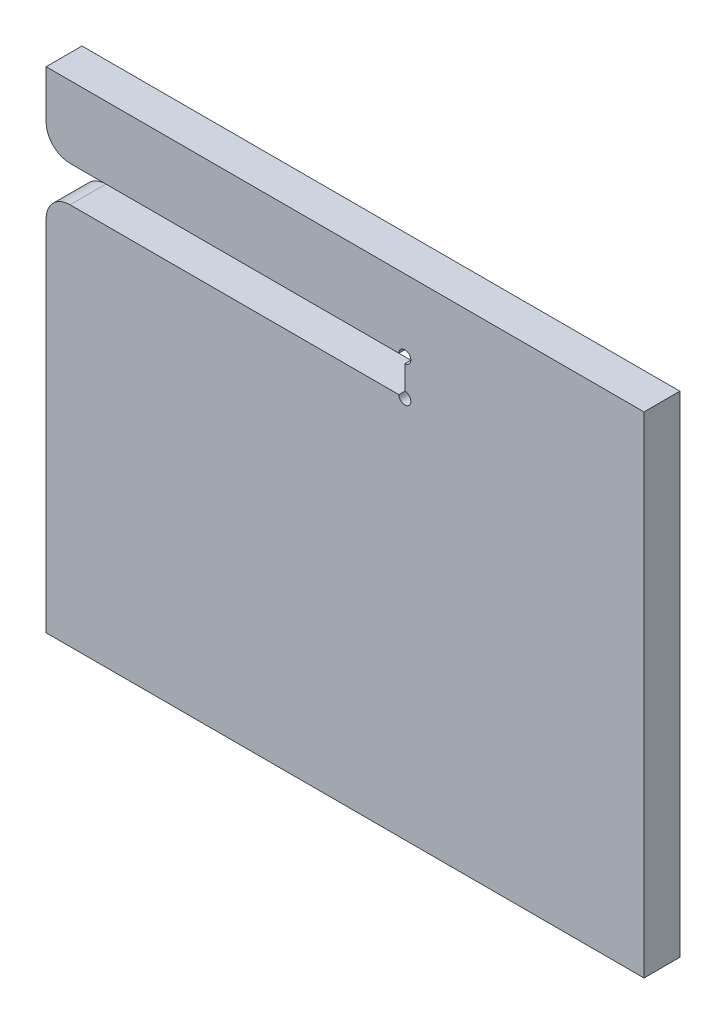
ISO-10303-21;
HEADER;
FILE_DESCRIPTION(('STEP AP214'),'2;1');
FILE_NAME('part.step','',(''),(''),'','','');
FILE_SCHEMA(('AUTOMOTIVE_DESIGN { 1 0 10303 214 1 1 1 1 }'));
ENDSEC;
DATA;
#1=APPLICATION_CONTEXT('core data for automotive mechanical design processes');
#2=APPLICATION_PROTOCOL_DEFINITION('international standard','automotive_design',2000,#1);
#3=PRODUCT_CONTEXT('',#1,'mechanical');
#4=PRODUCT('Part','Part','',(#3));
#5=PRODUCT_RELATED_PRODUCT_CATEGORY('part','',(#4));
#6=PRODUCT_DEFINITION_FORMATION('','',#4);
#7=PRODUCT_DEFINITION_CONTEXT('part definition',#1,'design');
#8=PRODUCT_DEFINITION('design','',#6,#7);
#9=PRODUCT_DEFINITION_SHAPE('','',#8);
#10=(LENGTH_UNIT() NAMED_UNIT(*) SI_UNIT(.MILLI.,.METRE.));
#11=(NAMED_UNIT(*) PLANE_ANGLE_UNIT() SI_UNIT($,.RADIAN.));
#12=(NAMED_UNIT(*) SI_UNIT($,.STERADIAN.) SOLID_ANGLE_UNIT());
#13=UNCERTAINTY_MEASURE_WITH_UNIT(LENGTH_MEASURE(1.E-05),#10,'distance_accuracy_value','');
#14=(GEOMETRIC_REPRESENTATION_CONTEXT(3) GLOBAL_UNCERTAINTY_ASSIGNED_CONTEXT((#13)) GLOBAL_UNIT_ASSIGNED_CONTEXT((#10,
#11,#12)) REPRESENTATION_CONTEXT('',''));
#15=CARTESIAN_POINT('',(0.,0.,0.));
#16=DIRECTION('',(0.,0.,1.));
#17=DIRECTION('',(1.,0.,0.));
#18=AXIS2_PLACEMENT_3D('',#15,#16,#17);
#19=CARTESIAN_POINT('',(-30.,6.,3.));
#20=DIRECTION('',(1.,0.,0.));
#21=DIRECTION('',(0.,1.,0.));
#22=AXIS2_PLACEMENT_3D('',#19,#20,#21);
#23=PLANE('',#22);
#24=DIRECTION('',(0.,-1.,0.));
#25=VECTOR('',#24,1.);
#26=CARTESIAN_POINT('',(-30.,6.,0.));
#27=LINE('',#26,#25);
#28=CARTESIAN_POINT('',(-30.,6.,0.));
#29=VERTEX_POINT('',#28);
#30=CARTESIAN_POINT('',(-30.,2.,0.));
#31=VERTEX_POINT('',#30);
#32=EDGE_CURVE('E193',#29,#31,#27,.T.);
#33=ORIENTED_EDGE('',*,*,#32,.T.);
#34=DIRECTION('',(0.,0.,-1.));
#35=VECTOR('',#34,1.);
#36=CARTESIAN_POINT('',(-30.,2.,3.));
#37=LINE('',#36,#35);
#38=CARTESIAN_POINT('',(-30.,2.,3.));
#39=VERTEX_POINT('',#38);
#40=EDGE_CURVE('E11',#31,#39,#37,.F.);
#41=ORIENTED_EDGE('',*,*,#40,.T.);
#42=DIRECTION('',(0.,-1.,0.));
#43=VECTOR('',#42,1.);
#44=CARTESIAN_POINT('',(-30.,6.,3.));
#45=LINE('',#44,#43);
#46=CARTESIAN_POINT('',(-30.,6.,3.));
#47=VERTEX_POINT('',#46);
#48=EDGE_CURVE('E183',#47,#39,#45,.T.);
#49=ORIENTED_EDGE('',*,*,#48,.F.);
#50=DIRECTION('',(0.,0.,-1.));
#51=VECTOR('',#50,1.);
#52=CARTESIAN_POINT('',(-30.,6.,3.));
#53=LINE('',#52,#51);
#54=EDGE_CURVE('E201',#47,#29,#53,.T.);
#55=ORIENTED_EDGE('',*,*,#54,.T.);
#56=EDGE_LOOP('',(#33,#41,#49,#55));
#57=FACE_BOUND('',#56,.T.);
#58=ADVANCED_FACE('F39',(#57),#23,.F.);
#59=CARTESIAN_POINT('',(0.,0.,3.));
#60=DIRECTION('',(0.,0.,1.));
#61=DIRECTION('',(1.,0.,0.));
#62=AXIS2_PLACEMENT_3D('',#59,#60,#61);
#63=PLANE('',#62);
#64=DIRECTION('',(1.,0.,0.));
#65=VECTOR('',#64,1.);
#66=CARTESIAN_POINT('',(-30.,-3.,3.));
#67=LINE('',#66,#65);
#68=CARTESIAN_POINT('',(-28.,-3.,3.));
#69=VERTEX_POINT('',#68);
#70=CARTESIAN_POINT('',(-0.5,-3.,3.));
#71=VERTEX_POINT('',#70);
#72=EDGE_CURVE('E129',#69,#71,#67,.T.);
#73=ORIENTED_EDGE('',*,*,#72,.F.);
#74=CARTESIAN_POINT('',(-28.,-5.,3.));
#75=DIRECTION('',(0.,0.,1.));
#76=DIRECTION('',(1.,0.,0.));
#77=AXIS2_PLACEMENT_3D('',#74,#75,#76);
#78=CIRCLE('',#77,2.);
#79=CARTESIAN_POINT('',(-30.,-5.,3.));
#80=VERTEX_POINT('',#79);
#81=EDGE_CURVE('E217',#69,#80,#78,.T.);
#82=ORIENTED_EDGE('',*,*,#81,.T.);
#83=CARTESIAN_POINT('',(-30.,-35.,3.));
#84=VERTEX_POINT('',#83);
#85=EDGE_CURVE('E184',#80,#84,#45,.T.);
#86=ORIENTED_EDGE('',*,*,#85,.T.);
#87=DIRECTION('',(1.,0.,0.));
#88=VECTOR('',#87,1.);
#89=CARTESIAN_POINT('',(-30.,-35.,3.));
#90=LINE('',#89,#88);
#91=CARTESIAN_POINT('',(20.,-35.,3.));
#92=VERTEX_POINT('',#91);
#93=EDGE_CURVE('E189',#84,#92,#90,.T.);
#94=ORIENTED_EDGE('',*,*,#93,.T.);
#95=DIRECTION('',(0.,1.,0.));
#96=VECTOR('',#95,1.);
#97=CARTESIAN_POINT('',(20.,6.,3.));
#98=LINE('',#97,#96);
#99=CARTESIAN_POINT('',(20.,6.,3.));
#100=VERTEX_POINT('',#99);
#101=EDGE_CURVE('E179',#92,#100,#98,.T.);
#102=ORIENTED_EDGE('',*,*,#101,.T.);
#103=DIRECTION('',(-1.,0.,0.));
#104=VECTOR('',#103,1.);
#105=CARTESIAN_POINT('',(-30.,6.,3.));
#106=LINE('',#105,#104);
#107=EDGE_CURVE('E182',#100,#47,#106,.T.);
#108=ORIENTED_EDGE('',*,*,#107,.T.);
#109=ORIENTED_EDGE('',*,*,#48,.T.);
#110=CARTESIAN_POINT('',(-28.,2.,3.));
#111=DIRECTION('',(0.,0.,1.));
#112=DIRECTION('',(1.,0.,0.));
#113=AXIS2_PLACEMENT_3D('',#110,#111,#112);
#114=CIRCLE('',#113,2.);
#115=CARTESIAN_POINT('',(-28.,0.,3.));
#116=VERTEX_POINT('',#115);
#117=EDGE_CURVE('E53',#39,#116,#114,.T.);
#118=ORIENTED_EDGE('',*,*,#117,.T.);
#119=DIRECTION('',(-1.,0.,0.));
#120=VECTOR('',#119,1.);
#121=CARTESIAN_POINT('',(-30.,0.,3.));
#122=LINE('',#121,#120);
#123=CARTESIAN_POINT('',(-0.5,0.,3.));
#124=VERTEX_POINT('',#123);
#125=EDGE_CURVE('E157',#124,#116,#122,.T.);
#126=ORIENTED_EDGE('',*,*,#125,.F.);
#127=CARTESIAN_POINT('',(0.,0.,3.));
#128=DIRECTION('',(0.,0.,1.));
#129=DIRECTION('',(-1.,0.,0.));
#130=AXIS2_PLACEMENT_3D('',#127,#128,#129);
#131=CIRCLE('',#130,0.5);
#132=CARTESIAN_POINT('',(0.,-0.5,3.));
#133=VERTEX_POINT('',#132);
#134=EDGE_CURVE('E154',#133,#124,#131,.T.);
#135=ORIENTED_EDGE('',*,*,#134,.F.);
#136=DIRECTION('',(0.,1.,0.));
#137=VECTOR('',#136,1.);
#138=CARTESIAN_POINT('',(0.,-0.5,3.));
#139=LINE('',#138,#137);
#140=CARTESIAN_POINT('',(0.,-2.5,3.));
#141=VERTEX_POINT('',#140);
#142=EDGE_CURVE('E153',#141,#133,#139,.T.);
#143=ORIENTED_EDGE('',*,*,#142,.F.);
#144=CARTESIAN_POINT('',(0.,-3.,3.));
#145=DIRECTION('',(0.,0.,1.));
#146=DIRECTION('',(-1.,0.,0.));
#147=AXIS2_PLACEMENT_3D('',#144,#145,#146);
#148=CIRCLE('',#147,0.5);
#149=EDGE_CURVE('E136',#71,#141,#148,.T.);
#150=ORIENTED_EDGE('',*,*,#149,.F.);
#151=EDGE_LOOP('',(#73,#82,#86,#94,#102,#108,#109,#118,#126,#135,#143,#150));
#152=FACE_BOUND('',#151,.T.);
#153=ADVANCED_FACE('F151',(#152),#63,.T.);
#154=CARTESIAN_POINT('',(0.,0.,0.));
#155=DIRECTION('',(0.,0.,1.));
#156=DIRECTION('',(1.,0.,0.));
#157=AXIS2_PLACEMENT_3D('',#154,#155,#156);
#158=PLANE('',#157);
#159=CARTESIAN_POINT('',(-30.,-5.,0.));
#160=VERTEX_POINT('',#159);
#161=CARTESIAN_POINT('',(-30.,-35.,0.));
#162=VERTEX_POINT('',#161);
#163=EDGE_CURVE('E191',#160,#162,#27,.T.);
#164=ORIENTED_EDGE('',*,*,#163,.F.);
#165=CARTESIAN_POINT('',(-28.,-5.,0.));
#166=DIRECTION('',(0.,0.,1.));
#167=DIRECTION('',(1.,0.,0.));
#168=AXIS2_PLACEMENT_3D('',#165,#166,#167);
#169=CIRCLE('',#168,2.);
#170=CARTESIAN_POINT('',(-28.,-3.,0.));
#171=VERTEX_POINT('',#170);
#172=EDGE_CURVE('E212',#160,#171,#169,.F.);
#173=ORIENTED_EDGE('',*,*,#172,.T.);
#174=DIRECTION('',(1.,0.,0.));
#175=VECTOR('',#174,1.);
#176=CARTESIAN_POINT('',(-30.,-3.,0.));
#177=LINE('',#176,#175);
#178=CARTESIAN_POINT('',(-0.5,-3.,0.));
#179=VERTEX_POINT('',#178);
#180=EDGE_CURVE('E165',#171,#179,#177,.T.);
#181=ORIENTED_EDGE('',*,*,#180,.T.);
#182=CARTESIAN_POINT('',(0.,-3.,0.));
#183=DIRECTION('',(0.,0.,1.));
#184=DIRECTION('',(-1.,0.,0.));
#185=AXIS2_PLACEMENT_3D('',#182,#183,#184);
#186=CIRCLE('',#185,0.5);
#187=CARTESIAN_POINT('',(0.,-2.5,0.));
#188=VERTEX_POINT('',#187);
#189=EDGE_CURVE('E148',#179,#188,#186,.T.);
#190=ORIENTED_EDGE('',*,*,#189,.T.);
#191=DIRECTION('',(0.,1.,0.));
#192=VECTOR('',#191,1.);
#193=CARTESIAN_POINT('',(0.,-0.5,0.));
#194=LINE('',#193,#192);
#195=CARTESIAN_POINT('',(0.,-0.5,0.));
#196=VERTEX_POINT('',#195);
#197=EDGE_CURVE('E164',#188,#196,#194,.T.);
#198=ORIENTED_EDGE('',*,*,#197,.T.);
#199=CARTESIAN_POINT('',(0.,0.,0.));
#200=DIRECTION('',(0.,0.,1.));
#201=DIRECTION('',(-1.,0.,0.));
#202=AXIS2_PLACEMENT_3D('',#199,#200,#201);
#203=CIRCLE('',#202,0.5);
#204=CARTESIAN_POINT('',(-0.5,0.,0.));
#205=VERTEX_POINT('',#204);
#206=EDGE_CURVE('E169',#196,#205,#203,.T.);
#207=ORIENTED_EDGE('',*,*,#206,.T.);
#208=DIRECTION('',(-1.,0.,0.));
#209=VECTOR('',#208,1.);
#210=CARTESIAN_POINT('',(-30.,0.,0.));
#211=LINE('',#210,#209);
#212=CARTESIAN_POINT('',(-28.,0.,0.));
#213=VERTEX_POINT('',#212);
#214=EDGE_CURVE('E138',#205,#213,#211,.T.);
#215=ORIENTED_EDGE('',*,*,#214,.T.);
#216=CARTESIAN_POINT('',(-28.,2.,0.));
#217=DIRECTION('',(0.,0.,1.));
#218=DIRECTION('',(1.,0.,0.));
#219=AXIS2_PLACEMENT_3D('',#216,#217,#218);
#220=CIRCLE('',#219,2.);
#221=EDGE_CURVE('E215',#213,#31,#220,.F.);
#222=ORIENTED_EDGE('',*,*,#221,.T.);
#223=ORIENTED_EDGE('',*,*,#32,.F.);
#224=DIRECTION('',(-1.,0.,0.));
#225=VECTOR('',#224,1.);
#226=CARTESIAN_POINT('',(-30.,6.,0.));
#227=LINE('',#226,#225);
#228=CARTESIAN_POINT('',(20.,6.,0.));
#229=VERTEX_POINT('',#228);
#230=EDGE_CURVE('E195',#229,#29,#227,.T.);
#231=ORIENTED_EDGE('',*,*,#230,.F.);
#232=DIRECTION('',(0.,1.,0.));
#233=VECTOR('',#232,1.);
#234=CARTESIAN_POINT('',(20.,6.,0.));
#235=LINE('',#234,#233);
#236=CARTESIAN_POINT('',(20.,-35.,0.));
#237=VERTEX_POINT('',#236);
#238=EDGE_CURVE('E150',#237,#229,#235,.T.);
#239=ORIENTED_EDGE('',*,*,#238,.F.);
#240=DIRECTION('',(1.,0.,0.));
#241=VECTOR('',#240,1.);
#242=CARTESIAN_POINT('',(-30.,-35.,0.));
#243=LINE('',#242,#241);
#244=EDGE_CURVE('E185',#162,#237,#243,.T.);
#245=ORIENTED_EDGE('',*,*,#244,.F.);
#246=EDGE_LOOP('',(#164,#173,#181,#190,#198,#207,#215,#222,#223,#231,#239,#245));
#247=FACE_BOUND('',#246,.T.);
#248=ADVANCED_FACE('F229',(#247),#158,.F.);
#249=CARTESIAN_POINT('',(20.,6.,3.));
#250=DIRECTION('',(-1.,0.,0.));
#251=DIRECTION('',(0.,-1.,0.));
#252=AXIS2_PLACEMENT_3D('',#249,#250,#251);
#253=PLANE('',#252);
#254=ORIENTED_EDGE('',*,*,#238,.T.);
#255=DIRECTION('',(0.,0.,-1.));
#256=VECTOR('',#255,1.);
#257=CARTESIAN_POINT('',(20.,6.,3.));
#258=LINE('',#257,#256);
#259=EDGE_CURVE('E206',#100,#229,#258,.T.);
#260=ORIENTED_EDGE('',*,*,#259,.F.);
#261=ORIENTED_EDGE('',*,*,#101,.F.);
#262=DIRECTION('',(0.,0.,-1.));
#263=VECTOR('',#262,1.);
#264=CARTESIAN_POINT('',(20.,-35.,3.));
#265=LINE('',#264,#263);
#266=EDGE_CURVE('E186',#92,#237,#265,.T.);
#267=ORIENTED_EDGE('',*,*,#266,.T.);
#268=EDGE_LOOP('',(#254,#260,#261,#267));
#269=FACE_BOUND('',#268,.T.);
#270=ADVANCED_FACE('F252',(#269),#253,.F.);
#271=CARTESIAN_POINT('',(-30.,6.,3.));
#272=DIRECTION('',(0.,-1.,0.));
#273=DIRECTION('',(0.,0.,-1.));
#274=AXIS2_PLACEMENT_3D('',#271,#272,#273);
#275=PLANE('',#274);
#276=ORIENTED_EDGE('',*,*,#230,.T.);
#277=ORIENTED_EDGE('',*,*,#54,.F.);
#278=ORIENTED_EDGE('',*,*,#107,.F.);
#279=ORIENTED_EDGE('',*,*,#259,.T.);
#280=EDGE_LOOP('',(#276,#277,#278,#279));
#281=FACE_BOUND('',#280,.T.);
#282=ADVANCED_FACE('F254',(#281),#275,.F.);
#283=ORIENTED_EDGE('',*,*,#85,.F.);
#284=DIRECTION('',(0.,0.,-1.));
#285=VECTOR('',#284,1.);
#286=CARTESIAN_POINT('',(-30.,-5.,0.));
#287=LINE('',#286,#285);
#288=EDGE_CURVE('E207',#80,#160,#287,.T.);
#289=ORIENTED_EDGE('',*,*,#288,.T.);
#290=ORIENTED_EDGE('',*,*,#163,.T.);
#291=DIRECTION('',(0.,0.,-1.));
#292=VECTOR('',#291,1.);
#293=CARTESIAN_POINT('',(-30.,-35.,3.));
#294=LINE('',#293,#292);
#295=EDGE_CURVE('E199',#84,#162,#294,.T.);
#296=ORIENTED_EDGE('',*,*,#295,.F.);
#297=EDGE_LOOP('',(#283,#289,#290,#296));
#298=FACE_BOUND('',#297,.T.);
#299=ADVANCED_FACE('F244',(#298),#23,.F.);
#300=CARTESIAN_POINT('',(-30.,-35.,3.));
#301=DIRECTION('',(0.,1.,0.));
#302=DIRECTION('',(0.,0.,1.));
#303=AXIS2_PLACEMENT_3D('',#300,#301,#302);
#304=PLANE('',#303);
#305=ORIENTED_EDGE('',*,*,#244,.T.);
#306=ORIENTED_EDGE('',*,*,#266,.F.);
#307=ORIENTED_EDGE('',*,*,#93,.F.);
#308=ORIENTED_EDGE('',*,*,#295,.T.);
#309=EDGE_LOOP('',(#305,#306,#307,#308));
#310=FACE_BOUND('',#309,.T.);
#311=ADVANCED_FACE('F250',(#310),#304,.F.);
#312=CARTESIAN_POINT('',(-30.,-3.,3.));
#313=DIRECTION('',(0.,1.,0.));
#314=DIRECTION('',(0.,0.,1.));
#315=AXIS2_PLACEMENT_3D('',#312,#313,#314);
#316=PLANE('',#315);
#317=ORIENTED_EDGE('',*,*,#180,.F.);
#318=DIRECTION('',(0.,0.,-1.));
#319=VECTOR('',#318,1.);
#320=CARTESIAN_POINT('',(-28.,-3.,3.));
#321=LINE('',#320,#319);
#322=EDGE_CURVE('E137',#171,#69,#321,.F.);
#323=ORIENTED_EDGE('',*,*,#322,.T.);
#324=ORIENTED_EDGE('',*,*,#72,.T.);
#325=DIRECTION('',(0.,0.,-1.));
#326=VECTOR('',#325,1.);
#327=CARTESIAN_POINT('',(-0.5,-3.,3.));
#328=LINE('',#327,#326);
#329=EDGE_CURVE('E135',#71,#179,#328,.T.);
#330=ORIENTED_EDGE('',*,*,#329,.T.);
#331=EDGE_LOOP('',(#317,#323,#324,#330));
#332=FACE_BOUND('',#331,.T.);
#333=ADVANCED_FACE('F134',(#332),#316,.T.);
#334=CARTESIAN_POINT('',(0.,-3.,3.));
#335=DIRECTION('',(0.,0.,-1.));
#336=DIRECTION('',(-1.,0.,0.));
#337=AXIS2_PLACEMENT_3D('',#334,#335,#336);
#338=CYLINDRICAL_SURFACE('',#337,0.5);
#339=ORIENTED_EDGE('',*,*,#189,.F.);
#340=ORIENTED_EDGE('',*,*,#329,.F.);
#341=ORIENTED_EDGE('',*,*,#149,.T.);
#342=DIRECTION('',(0.,0.,-1.));
#343=VECTOR('',#342,1.);
#344=CARTESIAN_POINT('',(0.,-2.5,3.));
#345=LINE('',#344,#343);
#346=EDGE_CURVE('E146',#141,#188,#345,.T.);
#347=ORIENTED_EDGE('',*,*,#346,.T.);
#348=EDGE_LOOP('',(#339,#340,#341,#347));
#349=FACE_BOUND('',#348,.T.);
#350=ADVANCED_FACE('F141',(#349),#338,.F.);
#351=CARTESIAN_POINT('',(0.,-0.5,3.));
#352=DIRECTION('',(-1.,0.,0.));
#353=DIRECTION('',(0.,-1.,0.));
#354=AXIS2_PLACEMENT_3D('',#351,#352,#353);
#355=PLANE('',#354);
#356=ORIENTED_EDGE('',*,*,#197,.F.);
#357=ORIENTED_EDGE('',*,*,#346,.F.);
#358=ORIENTED_EDGE('',*,*,#142,.T.);
#359=DIRECTION('',(0.,0.,-1.));
#360=VECTOR('',#359,1.);
#361=CARTESIAN_POINT('',(0.,-0.5,3.));
#362=LINE('',#361,#360);
#363=EDGE_CURVE('E173',#133,#196,#362,.T.);
#364=ORIENTED_EDGE('',*,*,#363,.T.);
#365=EDGE_LOOP('',(#356,#357,#358,#364));
#366=FACE_BOUND('',#365,.T.);
#367=ADVANCED_FACE('F233',(#366),#355,.T.);
#368=CARTESIAN_POINT('',(0.,0.,3.));
#369=DIRECTION('',(0.,0.,-1.));
#370=DIRECTION('',(-1.,0.,0.));
#371=AXIS2_PLACEMENT_3D('',#368,#369,#370);
#372=CYLINDRICAL_SURFACE('',#371,0.5);
#373=ORIENTED_EDGE('',*,*,#206,.F.);
#374=ORIENTED_EDGE('',*,*,#363,.F.);
#375=ORIENTED_EDGE('',*,*,#134,.T.);
#376=DIRECTION('',(0.,0.,-1.));
#377=VECTOR('',#376,1.);
#378=CARTESIAN_POINT('',(-0.5,0.,3.));
#379=LINE('',#378,#377);
#380=EDGE_CURVE('E161',#124,#205,#379,.T.);
#381=ORIENTED_EDGE('',*,*,#380,.T.);
#382=EDGE_LOOP('',(#373,#374,#375,#381));
#383=FACE_BOUND('',#382,.T.);
#384=ADVANCED_FACE('F234',(#383),#372,.F.);
#385=CARTESIAN_POINT('',(-30.,0.,3.));
#386=DIRECTION('',(0.,-1.,0.));
#387=DIRECTION('',(0.,0.,-1.));
#388=AXIS2_PLACEMENT_3D('',#385,#386,#387);
#389=PLANE('',#388);
#390=ORIENTED_EDGE('',*,*,#125,.T.);
#391=DIRECTION('',(0.,0.,-1.));
#392=VECTOR('',#391,1.);
#393=CARTESIAN_POINT('',(-28.,0.,0.));
#394=LINE('',#393,#392);
#395=EDGE_CURVE('E50',#116,#213,#394,.T.);
#396=ORIENTED_EDGE('',*,*,#395,.T.);
#397=ORIENTED_EDGE('',*,*,#214,.F.);
#398=ORIENTED_EDGE('',*,*,#380,.F.);
#399=EDGE_LOOP('',(#390,#396,#397,#398));
#400=FACE_BOUND('',#399,.T.);
#401=ADVANCED_FACE('F225',(#400),#389,.T.);
#402=CARTESIAN_POINT('',(-28.,-5.,3.));
#403=DIRECTION('',(0.,0.,1.));
#404=DIRECTION('',(1.,0.,0.));
#405=AXIS2_PLACEMENT_3D('',#402,#403,#404);
#406=CYLINDRICAL_SURFACE('',#405,2.);
#407=ORIENTED_EDGE('',*,*,#81,.F.);
#408=ORIENTED_EDGE('',*,*,#322,.F.);
#409=ORIENTED_EDGE('',*,*,#172,.F.);
#410=ORIENTED_EDGE('',*,*,#288,.F.);
#411=EDGE_LOOP('',(#407,#408,#409,#410));
#412=FACE_BOUND('',#411,.T.);
#413=ADVANCED_FACE('F240',(#412),#406,.T.);
#414=CARTESIAN_POINT('',(-28.,2.,3.));
#415=DIRECTION('',(0.,0.,1.));
#416=DIRECTION('',(1.,0.,0.));
#417=AXIS2_PLACEMENT_3D('',#414,#415,#416);
#418=CYLINDRICAL_SURFACE('',#417,2.);
#419=ORIENTED_EDGE('',*,*,#117,.F.);
#420=ORIENTED_EDGE('',*,*,#40,.F.);
#421=ORIENTED_EDGE('',*,*,#221,.F.);
#422=ORIENTED_EDGE('',*,*,#395,.F.);
#423=EDGE_LOOP('',(#419,#420,#421,#422));
#424=FACE_BOUND('',#423,.T.);
#425=ADVANCED_FACE('F41',(#424),#418,.T.);
#426=CLOSED_SHELL('',(#58,#153,#248,#270,#282,#299,#311,#333,#350,#367,#384,#401,#413,#425));
#427=MANIFOLD_SOLID_BREP('B2',#426);
#428=ADVANCED_BREP_SHAPE_REPRESENTATION('',(#18,#427),#14);
#429=SHAPE_DEFINITION_REPRESENTATION(#9,#428);
ENDSEC;
END-ISO-10303-21;
